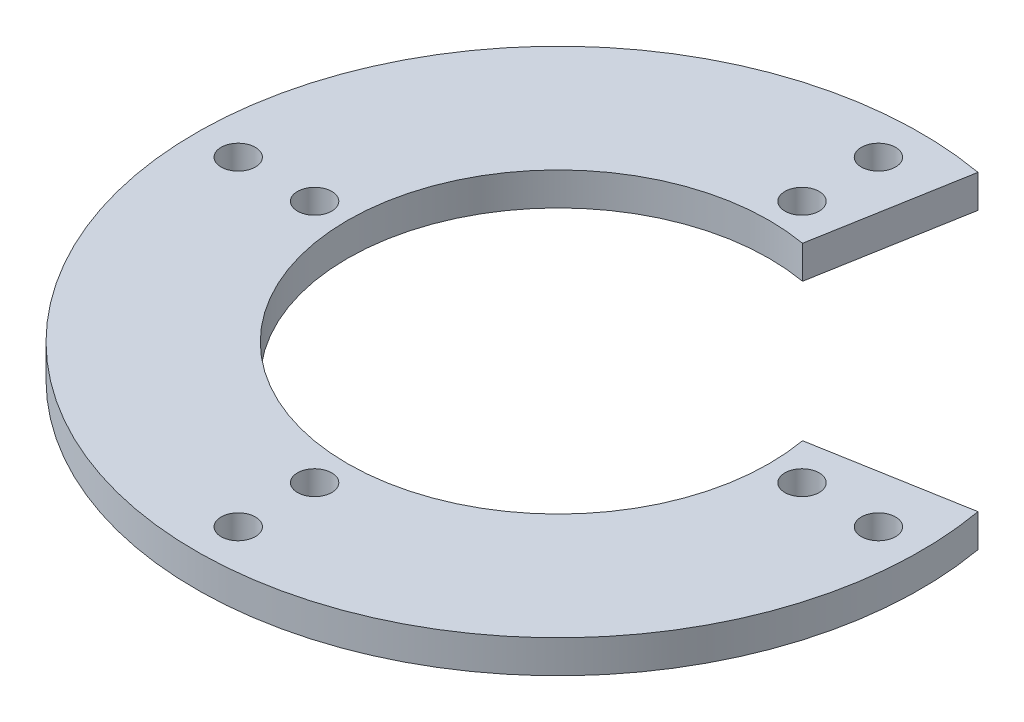
ISO-10303-21;
HEADER;
FILE_DESCRIPTION(('STEP AP214'),'2;1');
FILE_NAME('part.step','',(''),(''),'','','');
FILE_SCHEMA(('AUTOMOTIVE_DESIGN { 1 0 10303 214 1 1 1 1 }'));
ENDSEC;
DATA;
#1=APPLICATION_CONTEXT('core data for automotive mechanical design processes');
#2=APPLICATION_PROTOCOL_DEFINITION('international standard','automotive_design',2000,#1);
#3=PRODUCT_CONTEXT('',#1,'mechanical');
#4=PRODUCT('Part','Part','',(#3));
#5=PRODUCT_RELATED_PRODUCT_CATEGORY('part','',(#4));
#6=PRODUCT_DEFINITION_FORMATION('','',#4);
#7=PRODUCT_DEFINITION_CONTEXT('part definition',#1,'design');
#8=PRODUCT_DEFINITION('design','',#6,#7);
#9=PRODUCT_DEFINITION_SHAPE('','',#8);
#10=(LENGTH_UNIT() NAMED_UNIT(*) SI_UNIT(.MILLI.,.METRE.));
#11=(NAMED_UNIT(*) PLANE_ANGLE_UNIT() SI_UNIT($,.RADIAN.));
#12=(NAMED_UNIT(*) SI_UNIT($,.STERADIAN.) SOLID_ANGLE_UNIT());
#13=UNCERTAINTY_MEASURE_WITH_UNIT(LENGTH_MEASURE(1.E-05),#10,'distance_accuracy_value','');
#14=(GEOMETRIC_REPRESENTATION_CONTEXT(3) GLOBAL_UNCERTAINTY_ASSIGNED_CONTEXT((#13)) GLOBAL_UNIT_ASSIGNED_CONTEXT((#10,
#11,#12)) REPRESENTATION_CONTEXT('',''));
#15=CARTESIAN_POINT('',(0.,0.,0.));
#16=DIRECTION('',(0.,0.,1.));
#17=DIRECTION('',(1.,0.,0.));
#18=AXIS2_PLACEMENT_3D('',#15,#16,#17);
#19=CARTESIAN_POINT('',(0.,2.5,0.));
#20=DIRECTION('',(0.,-1.,0.));
#21=DIRECTION('',(0.,0.,-1.));
#22=AXIS2_PLACEMENT_3D('',#19,#20,#21);
#23=CYLINDRICAL_SURFACE('',#22,16.);
#24=CARTESIAN_POINT('',(0.,0.,0.));
#25=DIRECTION('',(0.,1.,0.));
#26=DIRECTION('',(0.,0.,1.));
#27=AXIS2_PLACEMENT_3D('',#24,#25,#26);
#28=CIRCLE('',#27,16.);
#29=CARTESIAN_POINT('',(2.77837084267084,0.,-15.7569240481953));
#30=VERTEX_POINT('',#29);
#31=CARTESIAN_POINT('',(15.7569240481953,0.,-2.7783708426709));
#32=VERTEX_POINT('',#31);
#33=EDGE_CURVE('E120',#30,#32,#28,.T.);
#34=ORIENTED_EDGE('',*,*,#33,.F.);
#35=DIRECTION('',(0.,-1.,0.));
#36=VECTOR('',#35,1.);
#37=CARTESIAN_POINT('',(2.77837084267084,2.5,-15.7569240481953));
#38=LINE('',#37,#36);
#39=CARTESIAN_POINT('',(2.77837084267084,2.5,-15.7569240481953));
#40=VERTEX_POINT('',#39);
#41=EDGE_CURVE('E11',#40,#30,#38,.T.);
#42=ORIENTED_EDGE('',*,*,#41,.F.);
#43=CARTESIAN_POINT('',(0.,2.5,0.));
#44=DIRECTION('',(0.,1.,0.));
#45=DIRECTION('',(0.,0.,1.));
#46=AXIS2_PLACEMENT_3D('',#43,#44,#45);
#47=CIRCLE('',#46,16.);
#48=CARTESIAN_POINT('',(15.7569240481953,2.5,-2.7783708426709));
#49=VERTEX_POINT('',#48);
#50=EDGE_CURVE('E97',#40,#49,#47,.T.);
#51=ORIENTED_EDGE('',*,*,#50,.T.);
#52=DIRECTION('',(0.,-1.,0.));
#53=VECTOR('',#52,1.);
#54=CARTESIAN_POINT('',(15.7569240481953,2.5,-2.7783708426709));
#55=LINE('',#54,#53);
#56=EDGE_CURVE('E58',#49,#32,#55,.T.);
#57=ORIENTED_EDGE('',*,*,#56,.T.);
#58=EDGE_LOOP('',(#34,#42,#51,#57));
#59=FACE_BOUND('',#58,.T.);
#60=ADVANCED_FACE('F41',(#59),#23,.F.);
#61=CARTESIAN_POINT('',(0.,2.5,0.));
#62=DIRECTION('',(-0.984807753012209,0.,-0.173648177666927));
#63=DIRECTION('',(-0.173648177666927,0.,0.984807753012209));
#64=AXIS2_PLACEMENT_3D('',#61,#62,#63);
#65=PLANE('',#64);
#66=DIRECTION('',(0.173648177666927,0.,-0.984807753012209));
#67=VECTOR('',#66,1.);
#68=CARTESIAN_POINT('',(0.,0.,0.));
#69=LINE('',#68,#67);
#70=CARTESIAN_POINT('',(4.7753248858405,0.,-27.0822132078357));
#71=VERTEX_POINT('',#70);
#72=EDGE_CURVE('E102',#30,#71,#69,.T.);
#73=ORIENTED_EDGE('',*,*,#72,.T.);
#74=DIRECTION('',(0.,-1.,0.));
#75=VECTOR('',#74,1.);
#76=CARTESIAN_POINT('',(4.7753248858405,2.5,-27.0822132078357));
#77=LINE('',#76,#75);
#78=CARTESIAN_POINT('',(4.7753248858405,2.5,-27.0822132078357));
#79=VERTEX_POINT('',#78);
#80=EDGE_CURVE('E50',#79,#71,#77,.T.);
#81=ORIENTED_EDGE('',*,*,#80,.F.);
#82=DIRECTION('',(0.173648177666927,0.,-0.984807753012209));
#83=VECTOR('',#82,1.);
#84=CARTESIAN_POINT('',(0.,2.5,0.));
#85=LINE('',#84,#83);
#86=EDGE_CURVE('E92',#40,#79,#85,.T.);
#87=ORIENTED_EDGE('',*,*,#86,.F.);
#88=ORIENTED_EDGE('',*,*,#41,.T.);
#89=EDGE_LOOP('',(#73,#81,#87,#88));
#90=FACE_BOUND('',#89,.T.);
#91=ADVANCED_FACE('F100',(#90),#65,.F.);
#92=CARTESIAN_POINT('',(0.,2.5,0.));
#93=DIRECTION('',(0.,-1.,0.));
#94=DIRECTION('',(0.,0.,-1.));
#95=AXIS2_PLACEMENT_3D('',#92,#93,#94);
#96=CYLINDRICAL_SURFACE('',#95,27.5);
#97=CARTESIAN_POINT('',(0.,0.,0.));
#98=DIRECTION('',(0.,1.,0.));
#99=DIRECTION('',(0.,0.,1.));
#100=AXIS2_PLACEMENT_3D('',#97,#98,#99);
#101=CIRCLE('',#100,27.5);
#102=CARTESIAN_POINT('',(27.0822132078357,0.,-4.7753248858406));
#103=VERTEX_POINT('',#102);
#104=EDGE_CURVE('E117',#71,#103,#101,.T.);
#105=ORIENTED_EDGE('',*,*,#104,.T.);
#106=DIRECTION('',(0.,-1.,0.));
#107=VECTOR('',#106,1.);
#108=CARTESIAN_POINT('',(27.0822132078357,2.5,-4.7753248858406));
#109=LINE('',#108,#107);
#110=CARTESIAN_POINT('',(27.0822132078357,2.5,-4.7753248858406));
#111=VERTEX_POINT('',#110);
#112=EDGE_CURVE('E72',#111,#103,#109,.T.);
#113=ORIENTED_EDGE('',*,*,#112,.F.);
#114=CARTESIAN_POINT('',(0.,2.5,0.));
#115=DIRECTION('',(0.,1.,0.));
#116=DIRECTION('',(0.,0.,1.));
#117=AXIS2_PLACEMENT_3D('',#114,#115,#116);
#118=CIRCLE('',#117,27.5);
#119=EDGE_CURVE('E84',#79,#111,#118,.T.);
#120=ORIENTED_EDGE('',*,*,#119,.F.);
#121=ORIENTED_EDGE('',*,*,#80,.T.);
#122=EDGE_LOOP('',(#105,#113,#120,#121));
#123=FACE_BOUND('',#122,.T.);
#124=ADVANCED_FACE('F86',(#123),#96,.T.);
#125=CARTESIAN_POINT('',(0.,2.5,-18.5));
#126=DIRECTION('',(0.,-1.,0.));
#127=DIRECTION('',(0.,0.,-1.));
#128=AXIS2_PLACEMENT_3D('',#125,#126,#127);
#129=CYLINDRICAL_SURFACE('',#128,1.3);
#130=CARTESIAN_POINT('',(0.,2.5,-18.5));
#131=DIRECTION('',(0.,1.,0.));
#132=DIRECTION('',(0.,0.,1.));
#133=AXIS2_PLACEMENT_3D('',#130,#131,#132);
#134=CIRCLE('',#133,1.3);
#135=CARTESIAN_POINT('',(0.,2.5,-17.2));
#136=VERTEX_POINT('',#135);
#137=EDGE_CURVE('E142',#136,#136,#134,.T.);
#138=ORIENTED_EDGE('',*,*,#137,.T.);
#139=EDGE_LOOP('',(#138));
#140=FACE_BOUND('',#139,.T.);
#141=CARTESIAN_POINT('',(0.,0.,-18.5));
#142=DIRECTION('',(0.,1.,0.));
#143=DIRECTION('',(0.,0.,1.));
#144=AXIS2_PLACEMENT_3D('',#141,#142,#143);
#145=CIRCLE('',#144,1.3);
#146=CARTESIAN_POINT('',(0.,0.,-17.2));
#147=VERTEX_POINT('',#146);
#148=EDGE_CURVE('E111',#147,#147,#145,.T.);
#149=ORIENTED_EDGE('',*,*,#148,.F.);
#150=EDGE_LOOP('',(#149));
#151=FACE_BOUND('',#150,.T.);
#152=ADVANCED_FACE('F293',(#140,#151),#129,.F.);
#153=CARTESIAN_POINT('',(0.,2.5,0.));
#154=DIRECTION('',(-0.173648177666931,0.,-0.984807753012208));
#155=DIRECTION('',(-0.984807753012208,0.,0.173648177666931));
#156=AXIS2_PLACEMENT_3D('',#153,#154,#155);
#157=PLANE('',#156);
#158=DIRECTION('',(0.984807753012208,0.,-0.173648177666931));
#159=VECTOR('',#158,1.);
#160=CARTESIAN_POINT('',(0.,0.,0.));
#161=LINE('',#160,#159);
#162=EDGE_CURVE('E114',#32,#103,#161,.T.);
#163=ORIENTED_EDGE('',*,*,#162,.F.);
#164=ORIENTED_EDGE('',*,*,#56,.F.);
#165=DIRECTION('',(0.984807753012208,0.,-0.173648177666931));
#166=VECTOR('',#165,1.);
#167=CARTESIAN_POINT('',(0.,2.5,0.));
#168=LINE('',#167,#166);
#169=EDGE_CURVE('E91',#49,#111,#168,.T.);
#170=ORIENTED_EDGE('',*,*,#169,.T.);
#171=ORIENTED_EDGE('',*,*,#112,.T.);
#172=EDGE_LOOP('',(#163,#164,#170,#171));
#173=FACE_BOUND('',#172,.T.);
#174=ADVANCED_FACE('F186',(#173),#157,.T.);
#175=CARTESIAN_POINT('',(18.5,2.5,0.));
#176=DIRECTION('',(0.,-1.,0.));
#177=DIRECTION('',(0.,0.,-1.));
#178=AXIS2_PLACEMENT_3D('',#175,#176,#177);
#179=CYLINDRICAL_SURFACE('',#178,1.3);
#180=CARTESIAN_POINT('',(18.5,2.5,0.));
#181=DIRECTION('',(0.,1.,0.));
#182=DIRECTION('',(0.,0.,1.));
#183=AXIS2_PLACEMENT_3D('',#180,#181,#182);
#184=CIRCLE('',#183,1.3);
#185=CARTESIAN_POINT('',(18.5,2.5,1.3));
#186=VERTEX_POINT('',#185);
#187=EDGE_CURVE('E147',#186,#186,#184,.T.);
#188=ORIENTED_EDGE('',*,*,#187,.T.);
#189=EDGE_LOOP('',(#188));
#190=FACE_BOUND('',#189,.T.);
#191=CARTESIAN_POINT('',(18.5,0.,0.));
#192=DIRECTION('',(0.,1.,0.));
#193=DIRECTION('',(0.,0.,1.));
#194=AXIS2_PLACEMENT_3D('',#191,#192,#193);
#195=CIRCLE('',#194,1.3);
#196=CARTESIAN_POINT('',(18.5,0.,1.3));
#197=VERTEX_POINT('',#196);
#198=EDGE_CURVE('E122',#197,#197,#195,.T.);
#199=ORIENTED_EDGE('',*,*,#198,.F.);
#200=EDGE_LOOP('',(#199));
#201=FACE_BOUND('',#200,.T.);
#202=ADVANCED_FACE('F182',(#190,#201),#179,.F.);
#203=CARTESIAN_POINT('',(24.3,2.5,0.));
#204=DIRECTION('',(0.,-1.,0.));
#205=DIRECTION('',(0.,0.,-1.));
#206=AXIS2_PLACEMENT_3D('',#203,#204,#205);
#207=CYLINDRICAL_SURFACE('',#206,1.3);
#208=CARTESIAN_POINT('',(24.3,2.5,0.));
#209=DIRECTION('',(0.,1.,0.));
#210=DIRECTION('',(0.,0.,1.));
#211=AXIS2_PLACEMENT_3D('',#208,#209,#210);
#212=CIRCLE('',#211,1.3);
#213=CARTESIAN_POINT('',(24.3,2.5,1.3));
#214=VERTEX_POINT('',#213);
#215=EDGE_CURVE('E150',#214,#214,#212,.T.);
#216=ORIENTED_EDGE('',*,*,#215,.T.);
#217=EDGE_LOOP('',(#216));
#218=FACE_BOUND('',#217,.T.);
#219=CARTESIAN_POINT('',(24.3,0.,0.));
#220=DIRECTION('',(0.,1.,0.));
#221=DIRECTION('',(0.,0.,1.));
#222=AXIS2_PLACEMENT_3D('',#219,#220,#221);
#223=CIRCLE('',#222,1.3);
#224=CARTESIAN_POINT('',(24.3,0.,1.3));
#225=VERTEX_POINT('',#224);
#226=EDGE_CURVE('E125',#225,#225,#223,.T.);
#227=ORIENTED_EDGE('',*,*,#226,.F.);
#228=EDGE_LOOP('',(#227));
#229=FACE_BOUND('',#228,.T.);
#230=ADVANCED_FACE('F185',(#218,#229),#207,.F.);
#231=CARTESIAN_POINT('',(0.,2.5,18.5));
#232=DIRECTION('',(0.,-1.,0.));
#233=DIRECTION('',(0.,0.,-1.));
#234=AXIS2_PLACEMENT_3D('',#231,#232,#233);
#235=CYLINDRICAL_SURFACE('',#234,1.3);
#236=CARTESIAN_POINT('',(0.,2.5,18.5));
#237=DIRECTION('',(0.,1.,0.));
#238=DIRECTION('',(0.,0.,1.));
#239=AXIS2_PLACEMENT_3D('',#236,#237,#238);
#240=CIRCLE('',#239,1.3);
#241=CARTESIAN_POINT('',(0.,2.5,19.8));
#242=VERTEX_POINT('',#241);
#243=EDGE_CURVE('E153',#242,#242,#240,.T.);
#244=ORIENTED_EDGE('',*,*,#243,.T.);
#245=EDGE_LOOP('',(#244));
#246=FACE_BOUND('',#245,.T.);
#247=CARTESIAN_POINT('',(0.,0.,18.5));
#248=DIRECTION('',(0.,1.,0.));
#249=DIRECTION('',(0.,0.,1.));
#250=AXIS2_PLACEMENT_3D('',#247,#248,#249);
#251=CIRCLE('',#250,1.3);
#252=CARTESIAN_POINT('',(0.,0.,19.8));
#253=VERTEX_POINT('',#252);
#254=EDGE_CURVE('E128',#253,#253,#251,.T.);
#255=ORIENTED_EDGE('',*,*,#254,.F.);
#256=EDGE_LOOP('',(#255));
#257=FACE_BOUND('',#256,.T.);
#258=ADVANCED_FACE('F217',(#246,#257),#235,.F.);
#259=CARTESIAN_POINT('',(0.,2.5,24.3));
#260=DIRECTION('',(0.,-1.,0.));
#261=DIRECTION('',(0.,0.,-1.));
#262=AXIS2_PLACEMENT_3D('',#259,#260,#261);
#263=CYLINDRICAL_SURFACE('',#262,1.3);
#264=CARTESIAN_POINT('',(0.,2.5,24.3));
#265=DIRECTION('',(0.,1.,0.));
#266=DIRECTION('',(0.,0.,1.));
#267=AXIS2_PLACEMENT_3D('',#264,#265,#266);
#268=CIRCLE('',#267,1.3);
#269=CARTESIAN_POINT('',(0.,2.5,25.6));
#270=VERTEX_POINT('',#269);
#271=EDGE_CURVE('E156',#270,#270,#268,.T.);
#272=ORIENTED_EDGE('',*,*,#271,.T.);
#273=EDGE_LOOP('',(#272));
#274=FACE_BOUND('',#273,.T.);
#275=CARTESIAN_POINT('',(0.,0.,24.3));
#276=DIRECTION('',(0.,1.,0.));
#277=DIRECTION('',(0.,0.,1.));
#278=AXIS2_PLACEMENT_3D('',#275,#276,#277);
#279=CIRCLE('',#278,1.3);
#280=CARTESIAN_POINT('',(0.,0.,25.6));
#281=VERTEX_POINT('',#280);
#282=EDGE_CURVE('E131',#281,#281,#279,.T.);
#283=ORIENTED_EDGE('',*,*,#282,.F.);
#284=EDGE_LOOP('',(#283));
#285=FACE_BOUND('',#284,.T.);
#286=ADVANCED_FACE('F221',(#274,#285),#263,.F.);
#287=CARTESIAN_POINT('',(-18.5,2.5,0.));
#288=DIRECTION('',(0.,-1.,0.));
#289=DIRECTION('',(0.,0.,-1.));
#290=AXIS2_PLACEMENT_3D('',#287,#288,#289);
#291=CYLINDRICAL_SURFACE('',#290,1.3);
#292=CARTESIAN_POINT('',(-18.5,2.5,0.));
#293=DIRECTION('',(0.,1.,0.));
#294=DIRECTION('',(0.,0.,1.));
#295=AXIS2_PLACEMENT_3D('',#292,#293,#294);
#296=CIRCLE('',#295,1.3);
#297=CARTESIAN_POINT('',(-18.5,2.5,1.3));
#298=VERTEX_POINT('',#297);
#299=EDGE_CURVE('E159',#298,#298,#296,.T.);
#300=ORIENTED_EDGE('',*,*,#299,.T.);
#301=EDGE_LOOP('',(#300));
#302=FACE_BOUND('',#301,.T.);
#303=CARTESIAN_POINT('',(-18.5,0.,0.));
#304=DIRECTION('',(0.,1.,0.));
#305=DIRECTION('',(0.,0.,1.));
#306=AXIS2_PLACEMENT_3D('',#303,#304,#305);
#307=CIRCLE('',#306,1.3);
#308=CARTESIAN_POINT('',(-18.5,0.,1.3));
#309=VERTEX_POINT('',#308);
#310=EDGE_CURVE('E134',#309,#309,#307,.T.);
#311=ORIENTED_EDGE('',*,*,#310,.F.);
#312=EDGE_LOOP('',(#311));
#313=FACE_BOUND('',#312,.T.);
#314=ADVANCED_FACE('F205',(#302,#313),#291,.F.);
#315=CARTESIAN_POINT('',(-24.3,2.5,0.));
#316=DIRECTION('',(0.,-1.,0.));
#317=DIRECTION('',(0.,0.,-1.));
#318=AXIS2_PLACEMENT_3D('',#315,#316,#317);
#319=CYLINDRICAL_SURFACE('',#318,1.3);
#320=CARTESIAN_POINT('',(-24.3,2.5,0.));
#321=DIRECTION('',(0.,1.,0.));
#322=DIRECTION('',(0.,0.,1.));
#323=AXIS2_PLACEMENT_3D('',#320,#321,#322);
#324=CIRCLE('',#323,1.3);
#325=CARTESIAN_POINT('',(-24.3,2.5,1.3));
#326=VERTEX_POINT('',#325);
#327=EDGE_CURVE('E110',#326,#326,#324,.T.);
#328=ORIENTED_EDGE('',*,*,#327,.T.);
#329=EDGE_LOOP('',(#328));
#330=FACE_BOUND('',#329,.T.);
#331=CARTESIAN_POINT('',(-24.3,0.,0.));
#332=DIRECTION('',(0.,1.,0.));
#333=DIRECTION('',(0.,0.,1.));
#334=AXIS2_PLACEMENT_3D('',#331,#332,#333);
#335=CIRCLE('',#334,1.3);
#336=CARTESIAN_POINT('',(-24.3,0.,1.3));
#337=VERTEX_POINT('',#336);
#338=EDGE_CURVE('E137',#337,#337,#335,.T.);
#339=ORIENTED_EDGE('',*,*,#338,.F.);
#340=EDGE_LOOP('',(#339));
#341=FACE_BOUND('',#340,.T.);
#342=ADVANCED_FACE('F43',(#330,#341),#319,.F.);
#343=CARTESIAN_POINT('',(0.,2.5,-24.3));
#344=DIRECTION('',(0.,-1.,0.));
#345=DIRECTION('',(0.,0.,-1.));
#346=AXIS2_PLACEMENT_3D('',#343,#344,#345);
#347=CYLINDRICAL_SURFACE('',#346,1.3);
#348=CARTESIAN_POINT('',(0.,2.5,-24.3));
#349=DIRECTION('',(0.,1.,0.));
#350=DIRECTION('',(0.,0.,1.));
#351=AXIS2_PLACEMENT_3D('',#348,#349,#350);
#352=CIRCLE('',#351,1.3);
#353=CARTESIAN_POINT('',(0.,2.5,-23.));
#354=VERTEX_POINT('',#353);
#355=EDGE_CURVE('E106',#354,#354,#352,.T.);
#356=ORIENTED_EDGE('',*,*,#355,.T.);
#357=EDGE_LOOP('',(#356));
#358=FACE_BOUND('',#357,.T.);
#359=CARTESIAN_POINT('',(0.,0.,-24.3));
#360=DIRECTION('',(0.,1.,0.));
#361=DIRECTION('',(0.,0.,1.));
#362=AXIS2_PLACEMENT_3D('',#359,#360,#361);
#363=CIRCLE('',#362,1.3);
#364=CARTESIAN_POINT('',(0.,0.,-23.));
#365=VERTEX_POINT('',#364);
#366=EDGE_CURVE('E107',#365,#365,#363,.T.);
#367=ORIENTED_EDGE('',*,*,#366,.F.);
#368=EDGE_LOOP('',(#367));
#369=FACE_BOUND('',#368,.T.);
#370=ADVANCED_FACE('F170',(#358,#369),#347,.F.);
#371=CARTESIAN_POINT('',(0.,2.5,0.));
#372=DIRECTION('',(0.,1.,0.));
#373=DIRECTION('',(0.,0.,1.));
#374=AXIS2_PLACEMENT_3D('',#371,#372,#373);
#375=PLANE('',#374);
#376=ORIENTED_EDGE('',*,*,#327,.F.);
#377=EDGE_LOOP('',(#376));
#378=FACE_BOUND('',#377,.T.);
#379=ORIENTED_EDGE('',*,*,#299,.F.);
#380=EDGE_LOOP('',(#379));
#381=FACE_BOUND('',#380,.T.);
#382=ORIENTED_EDGE('',*,*,#271,.F.);
#383=EDGE_LOOP('',(#382));
#384=FACE_BOUND('',#383,.T.);
#385=ORIENTED_EDGE('',*,*,#243,.F.);
#386=EDGE_LOOP('',(#385));
#387=FACE_BOUND('',#386,.T.);
#388=ORIENTED_EDGE('',*,*,#215,.F.);
#389=EDGE_LOOP('',(#388));
#390=FACE_BOUND('',#389,.T.);
#391=ORIENTED_EDGE('',*,*,#187,.F.);
#392=EDGE_LOOP('',(#391));
#393=FACE_BOUND('',#392,.T.);
#394=ORIENTED_EDGE('',*,*,#50,.F.);
#395=ORIENTED_EDGE('',*,*,#86,.T.);
#396=ORIENTED_EDGE('',*,*,#119,.T.);
#397=ORIENTED_EDGE('',*,*,#169,.F.);
#398=EDGE_LOOP('',(#394,#395,#396,#397));
#399=FACE_BOUND('',#398,.T.);
#400=ORIENTED_EDGE('',*,*,#137,.F.);
#401=EDGE_LOOP('',(#400));
#402=FACE_BOUND('',#401,.T.);
#403=ORIENTED_EDGE('',*,*,#355,.F.);
#404=EDGE_LOOP('',(#403));
#405=FACE_BOUND('',#404,.T.);
#406=ADVANCED_FACE('F95',(#378,#381,#384,#387,#390,#393,#399,#402,#405),#375,.T.);
#407=CARTESIAN_POINT('',(0.,0.,0.));
#408=DIRECTION('',(0.,1.,0.));
#409=DIRECTION('',(0.,0.,1.));
#410=AXIS2_PLACEMENT_3D('',#407,#408,#409);
#411=PLANE('',#410);
#412=ORIENTED_EDGE('',*,*,#338,.T.);
#413=EDGE_LOOP('',(#412));
#414=FACE_BOUND('',#413,.T.);
#415=ORIENTED_EDGE('',*,*,#310,.T.);
#416=EDGE_LOOP('',(#415));
#417=FACE_BOUND('',#416,.T.);
#418=ORIENTED_EDGE('',*,*,#282,.T.);
#419=EDGE_LOOP('',(#418));
#420=FACE_BOUND('',#419,.T.);
#421=ORIENTED_EDGE('',*,*,#254,.T.);
#422=EDGE_LOOP('',(#421));
#423=FACE_BOUND('',#422,.T.);
#424=ORIENTED_EDGE('',*,*,#226,.T.);
#425=EDGE_LOOP('',(#424));
#426=FACE_BOUND('',#425,.T.);
#427=ORIENTED_EDGE('',*,*,#198,.T.);
#428=EDGE_LOOP('',(#427));
#429=FACE_BOUND('',#428,.T.);
#430=ORIENTED_EDGE('',*,*,#33,.T.);
#431=ORIENTED_EDGE('',*,*,#162,.T.);
#432=ORIENTED_EDGE('',*,*,#104,.F.);
#433=ORIENTED_EDGE('',*,*,#72,.F.);
#434=EDGE_LOOP('',(#430,#431,#432,#433));
#435=FACE_BOUND('',#434,.T.);
#436=ORIENTED_EDGE('',*,*,#148,.T.);
#437=EDGE_LOOP('',(#436));
#438=FACE_BOUND('',#437,.T.);
#439=ORIENTED_EDGE('',*,*,#366,.T.);
#440=EDGE_LOOP('',(#439));
#441=FACE_BOUND('',#440,.T.);
#442=ADVANCED_FACE('F169',(#414,#417,#420,#423,#426,#429,#435,#438,#441),#411,.F.);
#443=CLOSED_SHELL('',(#60,#91,#124,#152,#174,#202,#230,#258,#286,#314,#342,#370,#406,#442));
#444=MANIFOLD_SOLID_BREP('B2',#443);
#445=ADVANCED_BREP_SHAPE_REPRESENTATION('',(#18,#444),#14);
#446=SHAPE_DEFINITION_REPRESENTATION(#9,#445);
ENDSEC;
END-ISO-10303-21;
